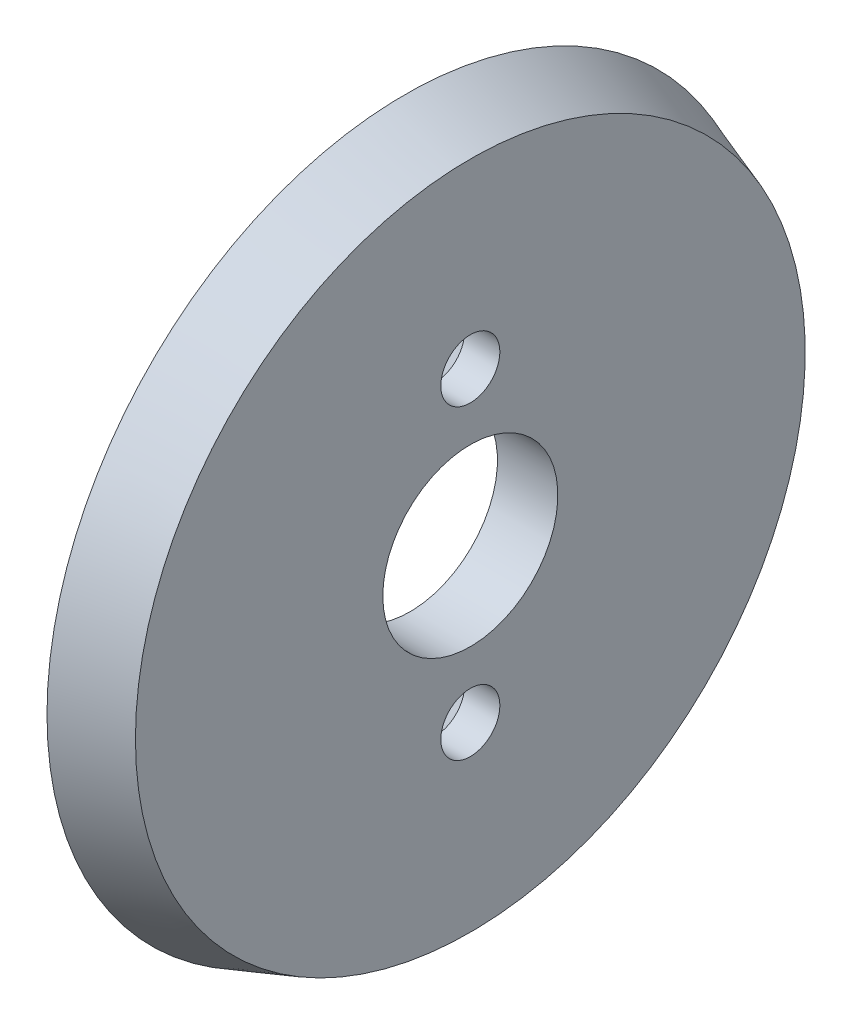
ISO-10303-21;
HEADER;
FILE_DESCRIPTION(('STEP AP214'),'2;1');
FILE_NAME('part.step','',(''),(''),'','','');
FILE_SCHEMA(('AUTOMOTIVE_DESIGN { 1 0 10303 214 1 1 1 1 }'));
ENDSEC;
DATA;
#1=APPLICATION_CONTEXT('core data for automotive mechanical design processes');
#2=APPLICATION_PROTOCOL_DEFINITION('international standard','automotive_design',2000,#1);
#3=PRODUCT_CONTEXT('',#1,'mechanical');
#4=PRODUCT('Part','Part','',(#3));
#5=PRODUCT_RELATED_PRODUCT_CATEGORY('part','',(#4));
#6=PRODUCT_DEFINITION_FORMATION('','',#4);
#7=PRODUCT_DEFINITION_CONTEXT('part definition',#1,'design');
#8=PRODUCT_DEFINITION('design','',#6,#7);
#9=PRODUCT_DEFINITION_SHAPE('','',#8);
#10=(LENGTH_UNIT() NAMED_UNIT(*) SI_UNIT(.MILLI.,.METRE.));
#11=(NAMED_UNIT(*) PLANE_ANGLE_UNIT() SI_UNIT($,.RADIAN.));
#12=(NAMED_UNIT(*) SI_UNIT($,.STERADIAN.) SOLID_ANGLE_UNIT());
#13=UNCERTAINTY_MEASURE_WITH_UNIT(LENGTH_MEASURE(1.E-05),#10,'distance_accuracy_value','');
#14=(GEOMETRIC_REPRESENTATION_CONTEXT(3) GLOBAL_UNCERTAINTY_ASSIGNED_CONTEXT((#13)) GLOBAL_UNIT_ASSIGNED_CONTEXT((#10,
#11,#12)) REPRESENTATION_CONTEXT('',''));
#15=CARTESIAN_POINT('',(0.,0.,0.));
#16=DIRECTION('',(0.,0.,1.));
#17=DIRECTION('',(1.,0.,0.));
#18=AXIS2_PLACEMENT_3D('',#15,#16,#17);
#19=CARTESIAN_POINT('',(9.95,15.3074060117302,0.));
#20=DIRECTION('',(1.,0.,0.));
#21=DIRECTION('',(0.,0.,-1.));
#22=AXIS2_PLACEMENT_3D('',#19,#20,#21);
#23=PLANE('',#22);
#24=CARTESIAN_POINT('',(9.95,7.,0.));
#25=DIRECTION('',(1.,0.,0.));
#26=DIRECTION('',(0.,0.,-1.));
#27=AXIS2_PLACEMENT_3D('',#24,#25,#26);
#28=CIRCLE('',#27,1.34999999999999);
#29=CARTESIAN_POINT('',(9.95,7.,-1.34999999999999));
#30=VERTEX_POINT('',#29);
#31=EDGE_CURVE('E84',#30,#30,#28,.T.);
#32=ORIENTED_EDGE('',*,*,#31,.F.);
#33=EDGE_LOOP('',(#32));
#34=FACE_BOUND('',#33,.T.);
#35=CARTESIAN_POINT('',(9.95,-7.,0.));
#36=DIRECTION('',(1.,0.,0.));
#37=DIRECTION('',(0.,0.,-1.));
#38=AXIS2_PLACEMENT_3D('',#35,#36,#37);
#39=CIRCLE('',#38,1.34999999999999);
#40=CARTESIAN_POINT('',(9.95,-7.,-1.34999999999999));
#41=VERTEX_POINT('',#40);
#42=EDGE_CURVE('E72',#41,#41,#39,.T.);
#43=ORIENTED_EDGE('',*,*,#42,.F.);
#44=EDGE_LOOP('',(#43));
#45=FACE_BOUND('',#44,.T.);
#46=CARTESIAN_POINT('',(9.95,0.,0.));
#47=DIRECTION('',(-1.,0.,0.));
#48=DIRECTION('',(0.,0.,1.));
#49=AXIS2_PLACEMENT_3D('',#46,#47,#48);
#50=CIRCLE('',#49,4.);
#51=CARTESIAN_POINT('',(9.95,0.,4.));
#52=VERTEX_POINT('',#51);
#53=EDGE_CURVE('E10',#52,#52,#50,.T.);
#54=ORIENTED_EDGE('',*,*,#53,.T.);
#55=EDGE_LOOP('',(#54));
#56=FACE_BOUND('',#55,.T.);
#57=CARTESIAN_POINT('',(9.95,0.,0.));
#58=DIRECTION('',(-1.,0.,0.));
#59=DIRECTION('',(0.,0.,1.));
#60=AXIS2_PLACEMENT_3D('',#57,#58,#59);
#61=CIRCLE('',#60,15.3074060117302);
#62=CARTESIAN_POINT('',(9.95,0.,15.3074060117302));
#63=VERTEX_POINT('',#62);
#64=EDGE_CURVE('E68',#63,#63,#61,.T.);
#65=ORIENTED_EDGE('',*,*,#64,.F.);
#66=EDGE_LOOP('',(#65));
#67=FACE_BOUND('',#66,.T.);
#68=ADVANCED_FACE('F41',(#34,#45,#56,#67),#23,.T.);
#69=CARTESIAN_POINT('',(15.4765408805031,0.,0.));
#70=DIRECTION('',(-1.,0.,0.));
#71=DIRECTION('',(0.,0.,1.));
#72=AXIS2_PLACEMENT_3D('',#69,#70,#71);
#73=CYLINDRICAL_SURFACE('',#72,4.);
#74=CARTESIAN_POINT('',(7.19057571478567,0.,0.));
#75=DIRECTION('',(-1.,0.,0.));
#76=DIRECTION('',(0.,0.,1.));
#77=AXIS2_PLACEMENT_3D('',#74,#75,#76);
#78=CIRCLE('',#77,4.);
#79=CARTESIAN_POINT('',(7.19057571478567,0.,4.));
#80=VERTEX_POINT('',#79);
#81=EDGE_CURVE('E48',#80,#80,#78,.T.);
#82=ORIENTED_EDGE('',*,*,#81,.T.);
#83=EDGE_LOOP('',(#82));
#84=FACE_BOUND('',#83,.T.);
#85=ORIENTED_EDGE('',*,*,#53,.F.);
#86=EDGE_LOOP('',(#85));
#87=FACE_BOUND('',#86,.T.);
#88=ADVANCED_FACE('F103',(#84,#87),#73,.F.);
#89=CARTESIAN_POINT('',(7.19057571478567,4.,0.));
#90=DIRECTION('',(-1.,0.,0.));
#91=DIRECTION('',(0.,0.,1.));
#92=AXIS2_PLACEMENT_3D('',#89,#90,#91);
#93=PLANE('',#92);
#94=CARTESIAN_POINT('',(7.19057571478567,7.,0.));
#95=DIRECTION('',(-1.,0.,0.));
#96=DIRECTION('',(0.,0.,1.));
#97=AXIS2_PLACEMENT_3D('',#94,#95,#96);
#98=CIRCLE('',#97,2.5);
#99=CARTESIAN_POINT('',(7.19057571478567,7.,2.5));
#100=VERTEX_POINT('',#99);
#101=EDGE_CURVE('E92',#100,#100,#98,.T.);
#102=ORIENTED_EDGE('',*,*,#101,.F.);
#103=EDGE_LOOP('',(#102));
#104=FACE_BOUND('',#103,.T.);
#105=CARTESIAN_POINT('',(7.19057571478567,-7.,0.));
#106=DIRECTION('',(-1.,0.,0.));
#107=DIRECTION('',(0.,0.,1.));
#108=AXIS2_PLACEMENT_3D('',#105,#106,#107);
#109=CIRCLE('',#108,2.5);
#110=CARTESIAN_POINT('',(7.19057571478567,-7.,2.5));
#111=VERTEX_POINT('',#110);
#112=EDGE_CURVE('E80',#111,#111,#109,.T.);
#113=ORIENTED_EDGE('',*,*,#112,.F.);
#114=EDGE_LOOP('',(#113));
#115=FACE_BOUND('',#114,.T.);
#116=CARTESIAN_POINT('',(7.19057571478567,0.,0.));
#117=DIRECTION('',(-1.,0.,0.));
#118=DIRECTION('',(0.,0.,1.));
#119=AXIS2_PLACEMENT_3D('',#116,#117,#118);
#120=CIRCLE('',#119,11.4579428160359);
#121=CARTESIAN_POINT('',(7.19057571478567,0.,11.4579428160359));
#122=VERTEX_POINT('',#121);
#123=EDGE_CURVE('E53',#122,#122,#120,.T.);
#124=ORIENTED_EDGE('',*,*,#123,.T.);
#125=EDGE_LOOP('',(#124));
#126=FACE_BOUND('',#125,.T.);
#127=ORIENTED_EDGE('',*,*,#81,.F.);
#128=EDGE_LOOP('',(#127));
#129=FACE_BOUND('',#128,.T.);
#130=ADVANCED_FACE('F99',(#104,#115,#126,#129),#93,.T.);
#131=CARTESIAN_POINT('',(7.19057571478567,0.,0.));
#132=DIRECTION('',(-1.,0.,0.));
#133=DIRECTION('',(0.,0.,1.));
#134=AXIS2_PLACEMENT_3D('',#131,#132,#133);
#135=CONICAL_SURFACE('',#134,11.4579428160359,0.338489364186048);
#136=CARTESIAN_POINT('',(5.45,0.,0.));
#137=DIRECTION('',(-1.,0.,0.));
#138=DIRECTION('',(0.,0.,1.));
#139=AXIS2_PLACEMENT_3D('',#136,#137,#138);
#140=CIRCLE('',#139,12.0706918238994);
#141=CARTESIAN_POINT('',(5.45,0.,12.0706918238994));
#142=VERTEX_POINT('',#141);
#143=EDGE_CURVE('E58',#142,#142,#140,.T.);
#144=ORIENTED_EDGE('',*,*,#143,.T.);
#145=EDGE_LOOP('',(#144));
#146=FACE_BOUND('',#145,.T.);
#147=ORIENTED_EDGE('',*,*,#123,.F.);
#148=EDGE_LOOP('',(#147));
#149=FACE_BOUND('',#148,.T.);
#150=ADVANCED_FACE('F102',(#146,#149),#135,.F.);
#151=CARTESIAN_POINT('',(5.45,0.,0.));
#152=DIRECTION('',(1.,0.,0.));
#153=DIRECTION('',(0.,0.,-1.));
#154=AXIS2_PLACEMENT_3D('',#151,#152,#153);
#155=CONICAL_SURFACE('',#154,12.0706918238994,1.23230696260885);
#156=CARTESIAN_POINT('',(6.96,0.,0.));
#157=DIRECTION('',(-1.,0.,0.));
#158=DIRECTION('',(0.,0.,1.));
#159=AXIS2_PLACEMENT_3D('',#156,#157,#158);
#160=CIRCLE('',#159,16.36);
#161=CARTESIAN_POINT('',(6.96,0.,16.36));
#162=VERTEX_POINT('',#161);
#163=EDGE_CURVE('E64',#162,#162,#160,.T.);
#164=ORIENTED_EDGE('',*,*,#163,.T.);
#165=EDGE_LOOP('',(#164));
#166=FACE_BOUND('',#165,.T.);
#167=ORIENTED_EDGE('',*,*,#143,.F.);
#168=EDGE_LOOP('',(#167));
#169=FACE_BOUND('',#168,.T.);
#170=ADVANCED_FACE('F111',(#166,#169),#155,.T.);
#171=CARTESIAN_POINT('',(6.96,0.,0.));
#172=DIRECTION('',(-1.,0.,0.));
#173=DIRECTION('',(0.,0.,1.));
#174=AXIS2_PLACEMENT_3D('',#171,#172,#173);
#175=CONICAL_SURFACE('',#174,16.36,0.338489364186047);
#176=ORIENTED_EDGE('',*,*,#64,.T.);
#177=EDGE_LOOP('',(#176));
#178=FACE_BOUND('',#177,.T.);
#179=ORIENTED_EDGE('',*,*,#163,.F.);
#180=EDGE_LOOP('',(#179));
#181=FACE_BOUND('',#180,.T.);
#182=ADVANCED_FACE('F117',(#178,#181),#175,.T.);
#183=CARTESIAN_POINT('',(7.19057571478567,-7.,0.));
#184=DIRECTION('',(-1.,0.,0.));
#185=DIRECTION('',(0.,0.,1.));
#186=AXIS2_PLACEMENT_3D('',#183,#184,#185);
#187=CYLINDRICAL_SURFACE('',#186,1.34999999999999);
#188=CARTESIAN_POINT('',(8.34057571478569,-7.,0.));
#189=DIRECTION('',(-1.,0.,0.));
#190=DIRECTION('',(0.,0.,1.));
#191=AXIS2_PLACEMENT_3D('',#188,#189,#190);
#192=CIRCLE('',#191,1.34999999999998);
#193=CARTESIAN_POINT('',(8.34057571478569,-7.,1.34999999999998));
#194=VERTEX_POINT('',#193);
#195=EDGE_CURVE('E76',#194,#194,#192,.T.);
#196=ORIENTED_EDGE('',*,*,#195,.T.);
#197=EDGE_LOOP('',(#196));
#198=FACE_BOUND('',#197,.T.);
#199=ORIENTED_EDGE('',*,*,#42,.T.);
#200=EDGE_LOOP('',(#199));
#201=FACE_BOUND('',#200,.T.);
#202=ADVANCED_FACE('F133',(#198,#201),#187,.F.);
#203=CARTESIAN_POINT('',(7.19057571478567,-7.,0.));
#204=DIRECTION('',(-1.,0.,0.));
#205=DIRECTION('',(0.,0.,1.));
#206=AXIS2_PLACEMENT_3D('',#203,#204,#205);
#207=CONICAL_SURFACE('',#206,2.5,0.78539816339745);
#208=ORIENTED_EDGE('',*,*,#195,.F.);
#209=EDGE_LOOP('',(#208));
#210=FACE_BOUND('',#209,.T.);
#211=ORIENTED_EDGE('',*,*,#112,.T.);
#212=EDGE_LOOP('',(#211));
#213=FACE_BOUND('',#212,.T.);
#214=ADVANCED_FACE('F141',(#210,#213),#207,.F.);
#215=CARTESIAN_POINT('',(7.19057571478567,7.,0.));
#216=DIRECTION('',(-1.,0.,0.));
#217=DIRECTION('',(0.,0.,1.));
#218=AXIS2_PLACEMENT_3D('',#215,#216,#217);
#219=CYLINDRICAL_SURFACE('',#218,1.34999999999999);
#220=CARTESIAN_POINT('',(8.34057571478569,7.,0.));
#221=DIRECTION('',(-1.,0.,0.));
#222=DIRECTION('',(0.,0.,1.));
#223=AXIS2_PLACEMENT_3D('',#220,#221,#222);
#224=CIRCLE('',#223,1.34999999999998);
#225=CARTESIAN_POINT('',(8.34057571478569,7.,1.34999999999998));
#226=VERTEX_POINT('',#225);
#227=EDGE_CURVE('E88',#226,#226,#224,.T.);
#228=ORIENTED_EDGE('',*,*,#227,.T.);
#229=EDGE_LOOP('',(#228));
#230=FACE_BOUND('',#229,.T.);
#231=ORIENTED_EDGE('',*,*,#31,.T.);
#232=EDGE_LOOP('',(#231));
#233=FACE_BOUND('',#232,.T.);
#234=ADVANCED_FACE('F147',(#230,#233),#219,.F.);
#235=CARTESIAN_POINT('',(7.19057571478567,7.,0.));
#236=DIRECTION('',(-1.,0.,0.));
#237=DIRECTION('',(0.,0.,1.));
#238=AXIS2_PLACEMENT_3D('',#235,#236,#237);
#239=CONICAL_SURFACE('',#238,2.5,0.785398163397451);
#240=ORIENTED_EDGE('',*,*,#227,.F.);
#241=EDGE_LOOP('',(#240));
#242=FACE_BOUND('',#241,.T.);
#243=ORIENTED_EDGE('',*,*,#101,.T.);
#244=EDGE_LOOP('',(#243));
#245=FACE_BOUND('',#244,.T.);
#246=ADVANCED_FACE('F97',(#242,#245),#239,.F.);
#247=CLOSED_SHELL('',(#68,#88,#130,#150,#170,#182,#202,#214,#234,#246));
#248=MANIFOLD_SOLID_BREP('B2',#247);
#249=ADVANCED_BREP_SHAPE_REPRESENTATION('',(#18,#248),#14);
#250=SHAPE_DEFINITION_REPRESENTATION(#9,#249);
ENDSEC;
END-ISO-10303-21;
